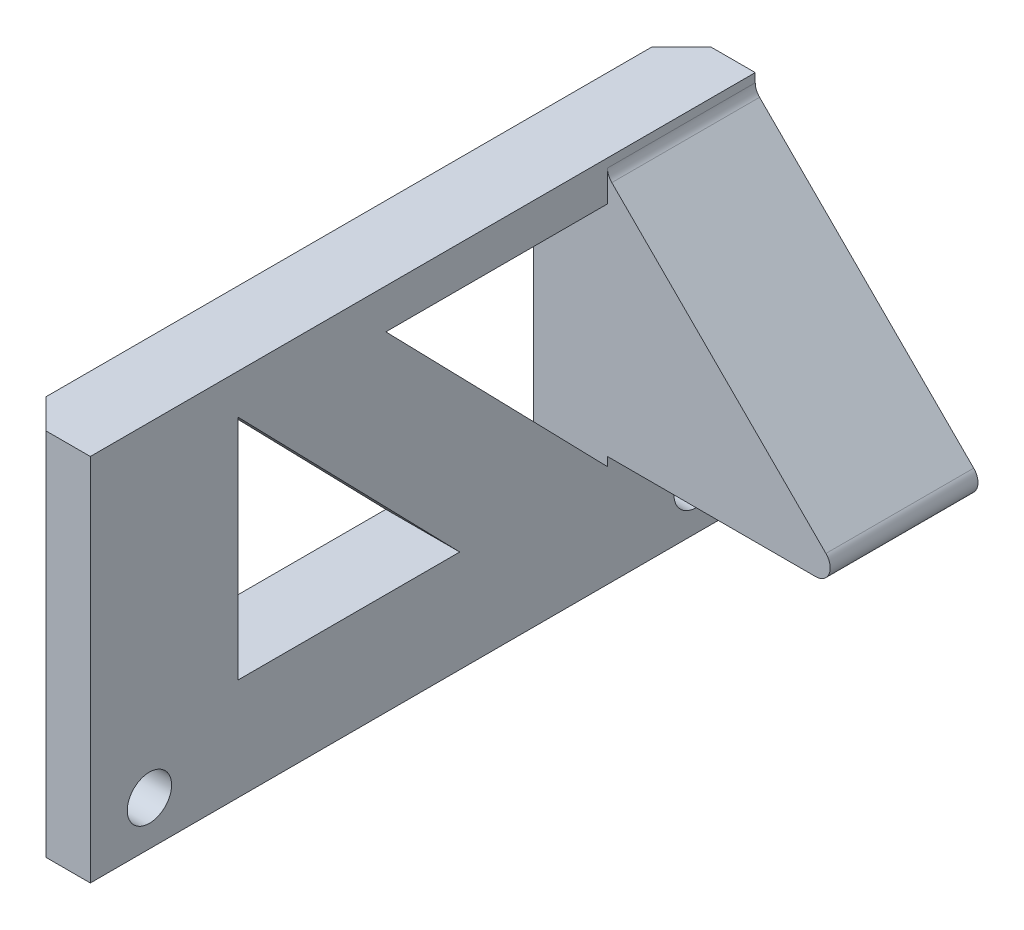
ISO-10303-21;
HEADER;
FILE_DESCRIPTION(('STEP AP214'),'2;1');
FILE_NAME('part.step','',(''),(''),'','','');
FILE_SCHEMA(('AUTOMOTIVE_DESIGN { 1 0 10303 214 1 1 1 1 }'));
ENDSEC;
DATA;
#1=APPLICATION_CONTEXT('core data for automotive mechanical design processes');
#2=APPLICATION_PROTOCOL_DEFINITION('international standard','automotive_design',2000,#1);
#3=PRODUCT_CONTEXT('',#1,'mechanical');
#4=PRODUCT('Part','Part','',(#3));
#5=PRODUCT_RELATED_PRODUCT_CATEGORY('part','',(#4));
#6=PRODUCT_DEFINITION_FORMATION('','',#4);
#7=PRODUCT_DEFINITION_CONTEXT('part definition',#1,'design');
#8=PRODUCT_DEFINITION('design','',#6,#7);
#9=PRODUCT_DEFINITION_SHAPE('','',#8);
#10=(LENGTH_UNIT() NAMED_UNIT(*) SI_UNIT(.MILLI.,.METRE.));
#11=(NAMED_UNIT(*) PLANE_ANGLE_UNIT() SI_UNIT($,.RADIAN.));
#12=(NAMED_UNIT(*) SI_UNIT($,.STERADIAN.) SOLID_ANGLE_UNIT());
#13=UNCERTAINTY_MEASURE_WITH_UNIT(LENGTH_MEASURE(1.E-05),#10,'distance_accuracy_value','');
#14=(GEOMETRIC_REPRESENTATION_CONTEXT(3) GLOBAL_UNCERTAINTY_ASSIGNED_CONTEXT((#13)) GLOBAL_UNIT_ASSIGNED_CONTEXT((#10,
#11,#12)) REPRESENTATION_CONTEXT('',''));
#15=CARTESIAN_POINT('',(0.,0.,0.));
#16=DIRECTION('',(0.,0.,1.));
#17=DIRECTION('',(1.,0.,0.));
#18=AXIS2_PLACEMENT_3D('',#15,#16,#17);
#19=CARTESIAN_POINT('',(5.,12.5,-22.5));
#20=DIRECTION('',(0.,0.,1.));
#21=DIRECTION('',(1.,0.,0.));
#22=AXIS2_PLACEMENT_3D('',#19,#20,#21);
#23=PLANE('',#22);
#24=DIRECTION('',(0.707106781186551,-0.707106781186544,0.));
#25=VECTOR('',#24,1.);
#26=CARTESIAN_POINT('',(21.4902925852937,-5.,-22.5));
#27=LINE('',#26,#25);
#28=CARTESIAN_POINT('',(5.29289321881346,11.1973993664801,-22.5));
#29=VERTEX_POINT('',#28);
#30=CARTESIAN_POINT('',(19.7831858041071,-3.29289321881345,-22.5));
#31=VERTEX_POINT('',#30);
#32=EDGE_CURVE('E295',#29,#31,#27,.T.);
#33=ORIENTED_EDGE('',*,*,#32,.T.);
#34=CARTESIAN_POINT('',(19.0760790229206,-4.,-22.5));
#35=DIRECTION('',(0.,0.,1.));
#36=DIRECTION('',(1.,0.,0.));
#37=AXIS2_PLACEMENT_3D('',#34,#35,#36);
#38=CIRCLE('',#37,1.);
#39=CARTESIAN_POINT('',(19.0760790229206,-5.,-22.5));
#40=VERTEX_POINT('',#39);
#41=EDGE_CURVE('E284',#31,#40,#38,.F.);
#42=ORIENTED_EDGE('',*,*,#41,.T.);
#43=DIRECTION('',(-1.,0.,0.));
#44=VECTOR('',#43,1.);
#45=CARTESIAN_POINT('',(5.,-5.,-22.5));
#46=LINE('',#45,#44);
#47=CARTESIAN_POINT('',(5.,-5.,-22.5));
#48=VERTEX_POINT('',#47);
#49=EDGE_CURVE('E302',#40,#48,#46,.T.);
#50=ORIENTED_EDGE('',*,*,#49,.T.);
#51=DIRECTION('',(0.,1.,0.));
#52=VECTOR('',#51,1.);
#53=CARTESIAN_POINT('',(5.,12.5,-22.5));
#54=LINE('',#53,#52);
#55=CARTESIAN_POINT('',(5.,-12.5,-22.5));
#56=VERTEX_POINT('',#55);
#57=EDGE_CURVE('E174',#56,#48,#54,.T.);
#58=ORIENTED_EDGE('',*,*,#57,.F.);
#59=DIRECTION('',(-1.,0.,0.));
#60=VECTOR('',#59,1.);
#61=CARTESIAN_POINT('',(5.,-12.5,-22.5));
#62=LINE('',#61,#60);
#63=CARTESIAN_POINT('',(2.,-12.5,-22.5));
#64=VERTEX_POINT('',#63);
#65=EDGE_CURVE('E242',#56,#64,#62,.T.);
#66=ORIENTED_EDGE('',*,*,#65,.T.);
#67=DIRECTION('',(0.,1.,0.));
#68=VECTOR('',#67,1.);
#69=CARTESIAN_POINT('',(2.,12.5,-22.5));
#70=LINE('',#69,#68);
#71=CARTESIAN_POINT('',(2.,12.5,-22.5));
#72=VERTEX_POINT('',#71);
#73=EDGE_CURVE('E277',#64,#72,#70,.T.);
#74=ORIENTED_EDGE('',*,*,#73,.T.);
#75=DIRECTION('',(-1.,0.,0.));
#76=VECTOR('',#75,1.);
#77=CARTESIAN_POINT('',(5.,12.5,-22.5));
#78=LINE('',#77,#76);
#79=CARTESIAN_POINT('',(5.,12.5,-22.5));
#80=VERTEX_POINT('',#79);
#81=EDGE_CURVE('E259',#80,#72,#78,.T.);
#82=ORIENTED_EDGE('',*,*,#81,.F.);
#83=CARTESIAN_POINT('',(5.,11.9045061476666,-22.5));
#84=VERTEX_POINT('',#83);
#85=EDGE_CURVE('E238',#84,#80,#54,.T.);
#86=ORIENTED_EDGE('',*,*,#85,.F.);
#87=CARTESIAN_POINT('',(6.,11.9045061476666,-22.5));
#88=DIRECTION('',(0.,0.,1.));
#89=DIRECTION('',(1.,0.,0.));
#90=AXIS2_PLACEMENT_3D('',#87,#88,#89);
#91=CIRCLE('',#90,1.);
#92=EDGE_CURVE('E47',#84,#29,#91,.T.);
#93=ORIENTED_EDGE('',*,*,#92,.T.);
#94=EDGE_LOOP('',(#33,#42,#50,#58,#66,#74,#82,#86,#93));
#95=FACE_BOUND('',#94,.T.);
#96=ADVANCED_FACE('F41',(#95),#23,.F.);
#97=CARTESIAN_POINT('',(5.,12.5,22.5));
#98=DIRECTION('',(0.,-1.,0.));
#99=DIRECTION('',(0.,0.,-1.));
#100=AXIS2_PLACEMENT_3D('',#97,#98,#99);
#101=PLANE('',#100);
#102=DIRECTION('',(0.,0.,1.));
#103=VECTOR('',#102,1.);
#104=CARTESIAN_POINT('',(0.,12.5,22.5));
#105=LINE('',#104,#103);
#106=CARTESIAN_POINT('',(0.,12.5,-20.5));
#107=VERTEX_POINT('',#106);
#108=CARTESIAN_POINT('',(0.,12.5,20.5));
#109=VERTEX_POINT('',#108);
#110=EDGE_CURVE('E227',#107,#109,#105,.T.);
#111=ORIENTED_EDGE('',*,*,#110,.T.);
#112=DIRECTION('',(-0.707106781186546,0.,-0.707106781186549));
#113=VECTOR('',#112,1.);
#114=CARTESIAN_POINT('',(2.,12.5,22.5));
#115=LINE('',#114,#113);
#116=CARTESIAN_POINT('',(2.,12.5,22.5));
#117=VERTEX_POINT('',#116);
#118=EDGE_CURVE('E274',#109,#117,#115,.F.);
#119=ORIENTED_EDGE('',*,*,#118,.T.);
#120=DIRECTION('',(-1.,0.,0.));
#121=VECTOR('',#120,1.);
#122=CARTESIAN_POINT('',(5.,12.5,22.5));
#123=LINE('',#122,#121);
#124=CARTESIAN_POINT('',(5.,12.5,22.5));
#125=VERTEX_POINT('',#124);
#126=EDGE_CURVE('E253',#125,#117,#123,.T.);
#127=ORIENTED_EDGE('',*,*,#126,.F.);
#128=DIRECTION('',(0.,0.,1.));
#129=VECTOR('',#128,1.);
#130=CARTESIAN_POINT('',(5.,12.5,22.5));
#131=LINE('',#130,#129);
#132=EDGE_CURVE('E240',#80,#125,#131,.T.);
#133=ORIENTED_EDGE('',*,*,#132,.F.);
#134=ORIENTED_EDGE('',*,*,#81,.T.);
#135=DIRECTION('',(0.707106781186546,0.,-0.707106781186549));
#136=VECTOR('',#135,1.);
#137=CARTESIAN_POINT('',(2.,12.5,-22.5));
#138=LINE('',#137,#136);
#139=EDGE_CURVE('E275',#72,#107,#138,.F.);
#140=ORIENTED_EDGE('',*,*,#139,.T.);
#141=EDGE_LOOP('',(#111,#119,#127,#133,#134,#140));
#142=FACE_BOUND('',#141,.T.);
#143=ADVANCED_FACE('F344',(#142),#101,.F.);
#144=CARTESIAN_POINT('',(5.,12.5,22.5));
#145=DIRECTION('',(0.,0.,-1.));
#146=DIRECTION('',(-1.,0.,0.));
#147=AXIS2_PLACEMENT_3D('',#144,#145,#146);
#148=PLANE('',#147);
#149=ORIENTED_EDGE('',*,*,#126,.T.);
#150=DIRECTION('',(0.,-1.,0.));
#151=VECTOR('',#150,1.);
#152=CARTESIAN_POINT('',(2.,12.5,22.5));
#153=LINE('',#152,#151);
#154=CARTESIAN_POINT('',(2.,-12.5,22.5));
#155=VERTEX_POINT('',#154);
#156=EDGE_CURVE('E263',#117,#155,#153,.T.);
#157=ORIENTED_EDGE('',*,*,#156,.T.);
#158=DIRECTION('',(-1.,0.,0.));
#159=VECTOR('',#158,1.);
#160=CARTESIAN_POINT('',(5.,-12.5,22.5));
#161=LINE('',#160,#159);
#162=CARTESIAN_POINT('',(5.,-12.5,22.5));
#163=VERTEX_POINT('',#162);
#164=EDGE_CURVE('E255',#163,#155,#161,.T.);
#165=ORIENTED_EDGE('',*,*,#164,.F.);
#166=DIRECTION('',(0.,-1.,0.));
#167=VECTOR('',#166,1.);
#168=CARTESIAN_POINT('',(5.,12.5,22.5));
#169=LINE('',#168,#167);
#170=EDGE_CURVE('E239',#125,#163,#169,.T.);
#171=ORIENTED_EDGE('',*,*,#170,.F.);
#172=EDGE_LOOP('',(#149,#157,#165,#171));
#173=FACE_BOUND('',#172,.T.);
#174=ADVANCED_FACE('F350',(#173),#148,.F.);
#175=CARTESIAN_POINT('',(5.,-12.5,22.5));
#176=DIRECTION('',(0.,1.,0.));
#177=DIRECTION('',(0.,0.,1.));
#178=AXIS2_PLACEMENT_3D('',#175,#176,#177);
#179=PLANE('',#178);
#180=ORIENTED_EDGE('',*,*,#164,.T.);
#181=DIRECTION('',(0.707106781186546,0.,0.707106781186549));
#182=VECTOR('',#181,1.);
#183=CARTESIAN_POINT('',(2.,-12.5,22.5));
#184=LINE('',#183,#182);
#185=CARTESIAN_POINT('',(0.,-12.5,20.5));
#186=VERTEX_POINT('',#185);
#187=EDGE_CURVE('E269',#155,#186,#184,.F.);
#188=ORIENTED_EDGE('',*,*,#187,.T.);
#189=DIRECTION('',(0.,0.,-1.));
#190=VECTOR('',#189,1.);
#191=CARTESIAN_POINT('',(0.,-12.5,22.5));
#192=LINE('',#191,#190);
#193=CARTESIAN_POINT('',(0.,-12.5,-20.5));
#194=VERTEX_POINT('',#193);
#195=EDGE_CURVE('E250',#186,#194,#192,.T.);
#196=ORIENTED_EDGE('',*,*,#195,.T.);
#197=DIRECTION('',(-0.707106781186546,0.,0.707106781186549));
#198=VECTOR('',#197,1.);
#199=CARTESIAN_POINT('',(2.,-12.5,-22.5));
#200=LINE('',#199,#198);
#201=EDGE_CURVE('E264',#194,#64,#200,.F.);
#202=ORIENTED_EDGE('',*,*,#201,.T.);
#203=ORIENTED_EDGE('',*,*,#65,.F.);
#204=DIRECTION('',(0.,0.,-1.));
#205=VECTOR('',#204,1.);
#206=CARTESIAN_POINT('',(5.,-12.5,22.5));
#207=LINE('',#206,#205);
#208=EDGE_CURVE('E245',#163,#56,#207,.T.);
#209=ORIENTED_EDGE('',*,*,#208,.F.);
#210=EDGE_LOOP('',(#180,#188,#196,#202,#203,#209));
#211=FACE_BOUND('',#210,.T.);
#212=ADVANCED_FACE('F353',(#211),#179,.F.);
#213=CARTESIAN_POINT('',(5.,0.,0.));
#214=DIRECTION('',(1.,0.,0.));
#215=DIRECTION('',(0.,0.,-1.));
#216=AXIS2_PLACEMENT_3D('',#213,#214,#215);
#217=PLANE('',#216);
#218=DIRECTION('',(0.,1.,0.));
#219=VECTOR('',#218,1.);
#220=CARTESIAN_POINT('',(5.,11.4902925852935,-12.5));
#221=LINE('',#220,#219);
#222=CARTESIAN_POINT('',(5.,9.80361420998697,-12.5));
#223=VERTEX_POINT('',#222);
#224=CARTESIAN_POINT('',(5.,11.9045061476666,-12.5));
#225=VERTEX_POINT('',#224);
#226=EDGE_CURVE('E57',#223,#225,#221,.T.);
#227=ORIENTED_EDGE('',*,*,#226,.T.);
#228=DIRECTION('',(0.,0.,-1.));
#229=VECTOR('',#228,1.);
#230=CARTESIAN_POINT('',(5.,11.9045061476666,-22.5));
#231=LINE('',#230,#229);
#232=EDGE_CURVE('E288',#225,#84,#231,.T.);
#233=ORIENTED_EDGE('',*,*,#232,.T.);
#234=ORIENTED_EDGE('',*,*,#85,.T.);
#235=ORIENTED_EDGE('',*,*,#132,.T.);
#236=ORIENTED_EDGE('',*,*,#170,.T.);
#237=ORIENTED_EDGE('',*,*,#208,.T.);
#238=ORIENTED_EDGE('',*,*,#57,.T.);
#239=DIRECTION('',(0.,0.,-1.));
#240=VECTOR('',#239,1.);
#241=CARTESIAN_POINT('',(5.,-5.,-12.5));
#242=LINE('',#241,#240);
#243=CARTESIAN_POINT('',(5.,-5.,-12.5));
#244=VERTEX_POINT('',#243);
#245=EDGE_CURVE('E162',#244,#48,#242,.T.);
#246=ORIENTED_EDGE('',*,*,#245,.F.);
#247=DIRECTION('',(0.,1.,0.));
#248=VECTOR('',#247,1.);
#249=CARTESIAN_POINT('',(5.,9.80361420998697,-12.5));
#250=LINE('',#249,#248);
#251=CARTESIAN_POINT('',(5.,-5.59947650810714,-12.5));
#252=VERTEX_POINT('',#251);
#253=EDGE_CURVE('E173',#252,#244,#250,.T.);
#254=ORIENTED_EDGE('',*,*,#253,.F.);
#255=DIRECTION('',(0.,-0.716418791651359,-0.697670491685585));
#256=VECTOR('',#255,1.);
#257=CARTESIAN_POINT('',(5.,-5.59947650810714,-12.5));
#258=LINE('',#257,#256);
#259=CARTESIAN_POINT('',(5.,9.80361420998697,2.5));
#260=VERTEX_POINT('',#259);
#261=EDGE_CURVE('E185',#260,#252,#258,.T.);
#262=ORIENTED_EDGE('',*,*,#261,.F.);
#263=DIRECTION('',(0.,0.,1.));
#264=VECTOR('',#263,1.);
#265=CARTESIAN_POINT('',(5.,9.80361420998697,2.5));
#266=LINE('',#265,#264);
#267=EDGE_CURVE('E182',#223,#260,#266,.T.);
#268=ORIENTED_EDGE('',*,*,#267,.F.);
#269=EDGE_LOOP('',(#227,#233,#234,#235,#236,#237,#238,#246,#254,#262,#268));
#270=FACE_BOUND('',#269,.T.);
#271=DIRECTION('',(0.,0.716418791651359,0.697670491685585));
#272=VECTOR('',#271,1.);
#273=CARTESIAN_POINT('',(5.,-5.59947650810714,-2.5));
#274=LINE('',#273,#272);
#275=CARTESIAN_POINT('',(5.,-5.59947650810714,-2.5));
#276=VERTEX_POINT('',#275);
#277=CARTESIAN_POINT('',(5.,9.80361420998697,12.5));
#278=VERTEX_POINT('',#277);
#279=EDGE_CURVE('E184',#276,#278,#274,.T.);
#280=ORIENTED_EDGE('',*,*,#279,.F.);
#281=DIRECTION('',(0.,0.,-1.));
#282=VECTOR('',#281,1.);
#283=CARTESIAN_POINT('',(5.,-5.59947650810714,12.5));
#284=LINE('',#283,#282);
#285=CARTESIAN_POINT('',(5.,-5.59947650810714,12.5));
#286=VERTEX_POINT('',#285);
#287=EDGE_CURVE('E203',#286,#276,#284,.T.);
#288=ORIENTED_EDGE('',*,*,#287,.F.);
#289=DIRECTION('',(0.,-1.,0.));
#290=VECTOR('',#289,1.);
#291=CARTESIAN_POINT('',(5.,9.80361420998697,12.5));
#292=LINE('',#291,#290);
#293=EDGE_CURVE('E215',#278,#286,#292,.T.);
#294=ORIENTED_EDGE('',*,*,#293,.F.);
#295=EDGE_LOOP('',(#280,#288,#294));
#296=FACE_BOUND('',#295,.T.);
#297=CARTESIAN_POINT('',(5.,-9.5,18.5));
#298=DIRECTION('',(1.,0.,0.));
#299=DIRECTION('',(0.,0.,-1.));
#300=AXIS2_PLACEMENT_3D('',#297,#298,#299);
#301=CIRCLE('',#300,1.5);
#302=CARTESIAN_POINT('',(5.,-9.5,17.));
#303=VERTEX_POINT('',#302);
#304=EDGE_CURVE('E226',#303,#303,#301,.T.);
#305=ORIENTED_EDGE('',*,*,#304,.F.);
#306=EDGE_LOOP('',(#305));
#307=FACE_BOUND('',#306,.T.);
#308=CARTESIAN_POINT('',(5.,-9.5,-18.5));
#309=DIRECTION('',(1.,0.,0.));
#310=DIRECTION('',(0.,0.,-1.));
#311=AXIS2_PLACEMENT_3D('',#308,#309,#310);
#312=CIRCLE('',#311,1.5);
#313=CARTESIAN_POINT('',(5.,-9.5,-20.));
#314=VERTEX_POINT('',#313);
#315=EDGE_CURVE('E233',#314,#314,#312,.T.);
#316=ORIENTED_EDGE('',*,*,#315,.F.);
#317=EDGE_LOOP('',(#316));
#318=FACE_BOUND('',#317,.T.);
#319=ADVANCED_FACE('F167',(#270,#296,#307,#318),#217,.T.);
#320=CARTESIAN_POINT('',(0.,0.,0.));
#321=DIRECTION('',(1.,0.,0.));
#322=DIRECTION('',(0.,0.,-1.));
#323=AXIS2_PLACEMENT_3D('',#320,#321,#322);
#324=PLANE('',#323);
#325=DIRECTION('',(0.,0.,1.));
#326=VECTOR('',#325,1.);
#327=CARTESIAN_POINT('',(0.,9.80361420998697,2.5));
#328=LINE('',#327,#326);
#329=CARTESIAN_POINT('',(0.,9.80361420998697,-12.5));
#330=VERTEX_POINT('',#329);
#331=CARTESIAN_POINT('',(0.,9.80361420998697,2.5));
#332=VERTEX_POINT('',#331);
#333=EDGE_CURVE('E195',#330,#332,#328,.T.);
#334=ORIENTED_EDGE('',*,*,#333,.T.);
#335=DIRECTION('',(0.,-0.716418791651359,-0.697670491685585));
#336=VECTOR('',#335,1.);
#337=CARTESIAN_POINT('',(0.,-5.59947650810714,-12.5));
#338=LINE('',#337,#336);
#339=CARTESIAN_POINT('',(0.,-5.59947650810714,-12.5));
#340=VERTEX_POINT('',#339);
#341=EDGE_CURVE('E189',#332,#340,#338,.T.);
#342=ORIENTED_EDGE('',*,*,#341,.T.);
#343=DIRECTION('',(0.,1.,0.));
#344=VECTOR('',#343,1.);
#345=CARTESIAN_POINT('',(0.,9.80361420998697,-12.5));
#346=LINE('',#345,#344);
#347=EDGE_CURVE('E193',#340,#330,#346,.T.);
#348=ORIENTED_EDGE('',*,*,#347,.T.);
#349=EDGE_LOOP('',(#334,#342,#348));
#350=FACE_BOUND('',#349,.T.);
#351=DIRECTION('',(0.,0.,-1.));
#352=VECTOR('',#351,1.);
#353=CARTESIAN_POINT('',(0.,-5.59947650810714,12.5));
#354=LINE('',#353,#352);
#355=CARTESIAN_POINT('',(0.,-5.59947650810714,12.5));
#356=VERTEX_POINT('',#355);
#357=CARTESIAN_POINT('',(0.,-5.59947650810714,-2.5));
#358=VERTEX_POINT('',#357);
#359=EDGE_CURVE('E210',#356,#358,#354,.T.);
#360=ORIENTED_EDGE('',*,*,#359,.T.);
#361=DIRECTION('',(0.,0.716418791651359,0.697670491685585));
#362=VECTOR('',#361,1.);
#363=CARTESIAN_POINT('',(0.,-5.59947650810714,-2.5));
#364=LINE('',#363,#362);
#365=CARTESIAN_POINT('',(0.,9.80361420998697,12.5));
#366=VERTEX_POINT('',#365);
#367=EDGE_CURVE('E197',#358,#366,#364,.T.);
#368=ORIENTED_EDGE('',*,*,#367,.T.);
#369=DIRECTION('',(0.,-1.,0.));
#370=VECTOR('',#369,1.);
#371=CARTESIAN_POINT('',(0.,9.80361420998697,12.5));
#372=LINE('',#371,#370);
#373=EDGE_CURVE('E205',#366,#356,#372,.T.);
#374=ORIENTED_EDGE('',*,*,#373,.T.);
#375=EDGE_LOOP('',(#360,#368,#374));
#376=FACE_BOUND('',#375,.T.);
#377=CARTESIAN_POINT('',(0.,-9.5,18.5));
#378=DIRECTION('',(1.,0.,0.));
#379=DIRECTION('',(0.,0.,-1.));
#380=AXIS2_PLACEMENT_3D('',#377,#378,#379);
#381=CIRCLE('',#380,1.5);
#382=CARTESIAN_POINT('',(0.,-9.5,17.));
#383=VERTEX_POINT('',#382);
#384=EDGE_CURVE('E223',#383,#383,#381,.T.);
#385=ORIENTED_EDGE('',*,*,#384,.T.);
#386=EDGE_LOOP('',(#385));
#387=FACE_BOUND('',#386,.T.);
#388=CARTESIAN_POINT('',(0.,-9.5,-18.5));
#389=DIRECTION('',(1.,0.,0.));
#390=DIRECTION('',(0.,0.,-1.));
#391=AXIS2_PLACEMENT_3D('',#388,#389,#390);
#392=CIRCLE('',#391,1.5);
#393=CARTESIAN_POINT('',(0.,-9.5,-20.));
#394=VERTEX_POINT('',#393);
#395=EDGE_CURVE('E219',#394,#394,#392,.T.);
#396=ORIENTED_EDGE('',*,*,#395,.T.);
#397=EDGE_LOOP('',(#396));
#398=FACE_BOUND('',#397,.T.);
#399=ORIENTED_EDGE('',*,*,#195,.F.);
#400=DIRECTION('',(0.,1.,0.));
#401=VECTOR('',#400,1.);
#402=CARTESIAN_POINT('',(0.,0.,20.5));
#403=LINE('',#402,#401);
#404=EDGE_CURVE('E267',#186,#109,#403,.T.);
#405=ORIENTED_EDGE('',*,*,#404,.T.);
#406=ORIENTED_EDGE('',*,*,#110,.F.);
#407=DIRECTION('',(0.,-1.,0.));
#408=VECTOR('',#407,1.);
#409=CARTESIAN_POINT('',(0.,0.,-20.5));
#410=LINE('',#409,#408);
#411=EDGE_CURVE('E270',#107,#194,#410,.T.);
#412=ORIENTED_EDGE('',*,*,#411,.T.);
#413=EDGE_LOOP('',(#399,#405,#406,#412));
#414=FACE_BOUND('',#413,.T.);
#415=ADVANCED_FACE('F322',(#350,#376,#387,#398,#414),#324,.F.);
#416=CARTESIAN_POINT('',(0.,-9.5,-18.5));
#417=DIRECTION('',(1.,0.,0.));
#418=DIRECTION('',(0.,0.,-1.));
#419=AXIS2_PLACEMENT_3D('',#416,#417,#418);
#420=CYLINDRICAL_SURFACE('',#419,1.5);
#421=ORIENTED_EDGE('',*,*,#395,.F.);
#422=EDGE_LOOP('',(#421));
#423=FACE_BOUND('',#422,.T.);
#424=ORIENTED_EDGE('',*,*,#315,.T.);
#425=EDGE_LOOP('',(#424));
#426=FACE_BOUND('',#425,.T.);
#427=ADVANCED_FACE('F321',(#423,#426),#420,.F.);
#428=CARTESIAN_POINT('',(0.,-9.5,18.5));
#429=DIRECTION('',(1.,0.,0.));
#430=DIRECTION('',(0.,0.,-1.));
#431=AXIS2_PLACEMENT_3D('',#428,#429,#430);
#432=CYLINDRICAL_SURFACE('',#431,1.5);
#433=ORIENTED_EDGE('',*,*,#384,.F.);
#434=EDGE_LOOP('',(#433));
#435=FACE_BOUND('',#434,.T.);
#436=ORIENTED_EDGE('',*,*,#304,.T.);
#437=EDGE_LOOP('',(#436));
#438=FACE_BOUND('',#437,.T.);
#439=ADVANCED_FACE('F403',(#435,#438),#432,.F.);
#440=CARTESIAN_POINT('',(0.,-5.59947650810714,-2.5));
#441=DIRECTION('',(0.,0.697670491685585,-0.716418791651359));
#442=DIRECTION('',(0.,0.716418791651359,0.697670491685585));
#443=AXIS2_PLACEMENT_3D('',#440,#441,#442);
#444=PLANE('',#443);
#445=ORIENTED_EDGE('',*,*,#279,.T.);
#446=DIRECTION('',(1.,0.,0.));
#447=VECTOR('',#446,1.);
#448=CARTESIAN_POINT('',(0.,9.80361420998697,12.5));
#449=LINE('',#448,#447);
#450=EDGE_CURVE('E208',#366,#278,#449,.T.);
#451=ORIENTED_EDGE('',*,*,#450,.F.);
#452=ORIENTED_EDGE('',*,*,#367,.F.);
#453=DIRECTION('',(1.,0.,0.));
#454=VECTOR('',#453,1.);
#455=CARTESIAN_POINT('',(0.,-5.59947650810714,-2.5));
#456=LINE('',#455,#454);
#457=EDGE_CURVE('E220',#358,#276,#456,.T.);
#458=ORIENTED_EDGE('',*,*,#457,.T.);
#459=EDGE_LOOP('',(#445,#451,#452,#458));
#460=FACE_BOUND('',#459,.T.);
#461=ADVANCED_FACE('F400',(#460),#444,.F.);
#462=CARTESIAN_POINT('',(0.,-5.59947650810714,12.5));
#463=DIRECTION('',(0.,-1.,0.));
#464=DIRECTION('',(0.,0.,-1.));
#465=AXIS2_PLACEMENT_3D('',#462,#463,#464);
#466=PLANE('',#465);
#467=ORIENTED_EDGE('',*,*,#287,.T.);
#468=ORIENTED_EDGE('',*,*,#457,.F.);
#469=ORIENTED_EDGE('',*,*,#359,.F.);
#470=DIRECTION('',(1.,0.,0.));
#471=VECTOR('',#470,1.);
#472=CARTESIAN_POINT('',(0.,-5.59947650810714,12.5));
#473=LINE('',#472,#471);
#474=EDGE_CURVE('E217',#356,#286,#473,.T.);
#475=ORIENTED_EDGE('',*,*,#474,.T.);
#476=EDGE_LOOP('',(#467,#468,#469,#475));
#477=FACE_BOUND('',#476,.T.);
#478=ADVANCED_FACE('F392',(#477),#466,.F.);
#479=CARTESIAN_POINT('',(0.,9.80361420998697,12.5));
#480=DIRECTION('',(0.,0.,1.));
#481=DIRECTION('',(1.,0.,0.));
#482=AXIS2_PLACEMENT_3D('',#479,#480,#481);
#483=PLANE('',#482);
#484=ORIENTED_EDGE('',*,*,#293,.T.);
#485=ORIENTED_EDGE('',*,*,#474,.F.);
#486=ORIENTED_EDGE('',*,*,#373,.F.);
#487=ORIENTED_EDGE('',*,*,#450,.T.);
#488=EDGE_LOOP('',(#484,#485,#486,#487));
#489=FACE_BOUND('',#488,.T.);
#490=ADVANCED_FACE('F395',(#489),#483,.F.);
#491=CARTESIAN_POINT('',(0.,-5.59947650810714,-12.5));
#492=DIRECTION('',(0.,-0.697670491685585,0.716418791651359));
#493=DIRECTION('',(0.,-0.716418791651359,-0.697670491685585));
#494=AXIS2_PLACEMENT_3D('',#491,#492,#493);
#495=PLANE('',#494);
#496=ORIENTED_EDGE('',*,*,#261,.T.);
#497=DIRECTION('',(1.,0.,0.));
#498=VECTOR('',#497,1.);
#499=CARTESIAN_POINT('',(0.,-5.59947650810714,-12.5));
#500=LINE('',#499,#498);
#501=EDGE_CURVE('E181',#340,#252,#500,.T.);
#502=ORIENTED_EDGE('',*,*,#501,.F.);
#503=ORIENTED_EDGE('',*,*,#341,.F.);
#504=DIRECTION('',(1.,0.,0.));
#505=VECTOR('',#504,1.);
#506=CARTESIAN_POINT('',(0.,9.80361420998697,2.5));
#507=LINE('',#506,#505);
#508=EDGE_CURVE('E176',#332,#260,#507,.T.);
#509=ORIENTED_EDGE('',*,*,#508,.T.);
#510=EDGE_LOOP('',(#496,#502,#503,#509));
#511=FACE_BOUND('',#510,.T.);
#512=ADVANCED_FACE('F320',(#511),#495,.F.);
#513=CARTESIAN_POINT('',(0.,9.80361420998697,2.5));
#514=DIRECTION('',(0.,1.,0.));
#515=DIRECTION('',(0.,0.,1.));
#516=AXIS2_PLACEMENT_3D('',#513,#514,#515);
#517=PLANE('',#516);
#518=ORIENTED_EDGE('',*,*,#267,.T.);
#519=ORIENTED_EDGE('',*,*,#508,.F.);
#520=ORIENTED_EDGE('',*,*,#333,.F.);
#521=DIRECTION('',(1.,0.,0.));
#522=VECTOR('',#521,1.);
#523=CARTESIAN_POINT('',(0.,9.80361420998697,-12.5));
#524=LINE('',#523,#522);
#525=EDGE_CURVE('E313',#330,#223,#524,.T.);
#526=ORIENTED_EDGE('',*,*,#525,.T.);
#527=EDGE_LOOP('',(#518,#519,#520,#526));
#528=FACE_BOUND('',#527,.T.);
#529=ADVANCED_FACE('F316',(#528),#517,.F.);
#530=CARTESIAN_POINT('',(0.,9.80361420998697,-12.5));
#531=DIRECTION('',(0.,0.,-1.));
#532=DIRECTION('',(0.,1.,0.));
#533=AXIS2_PLACEMENT_3D('',#530,#531,#532);
#534=PLANE('',#533);
#535=DIRECTION('',(-1.,0.,0.));
#536=VECTOR('',#535,1.);
#537=CARTESIAN_POINT('',(5.,-5.,-12.5));
#538=LINE('',#537,#536);
#539=CARTESIAN_POINT('',(19.0760790229206,-5.,-12.5));
#540=VERTEX_POINT('',#539);
#541=EDGE_CURVE('E158',#540,#244,#538,.T.);
#542=ORIENTED_EDGE('',*,*,#541,.F.);
#543=CARTESIAN_POINT('',(19.0760790229206,-4.,-12.5));
#544=DIRECTION('',(0.,0.,-1.));
#545=DIRECTION('',(0.,1.,0.));
#546=AXIS2_PLACEMENT_3D('',#543,#544,#545);
#547=CIRCLE('',#546,1.);
#548=CARTESIAN_POINT('',(19.7831858041071,-3.29289321881345,-12.5));
#549=VERTEX_POINT('',#548);
#550=EDGE_CURVE('E286',#540,#549,#547,.F.);
#551=ORIENTED_EDGE('',*,*,#550,.T.);
#552=DIRECTION('',(0.707106781186551,-0.707106781186544,0.));
#553=VECTOR('',#552,1.);
#554=CARTESIAN_POINT('',(21.4902925852937,-5.,-12.5));
#555=LINE('',#554,#553);
#556=CARTESIAN_POINT('',(5.29289321881346,11.1973993664801,-12.5));
#557=VERTEX_POINT('',#556);
#558=EDGE_CURVE('E170',#557,#549,#555,.T.);
#559=ORIENTED_EDGE('',*,*,#558,.F.);
#560=CARTESIAN_POINT('',(6.,11.9045061476666,-12.5));
#561=DIRECTION('',(0.,0.,-1.));
#562=DIRECTION('',(0.,1.,0.));
#563=AXIS2_PLACEMENT_3D('',#560,#561,#562);
#564=CIRCLE('',#563,1.);
#565=EDGE_CURVE('E11',#557,#225,#564,.T.);
#566=ORIENTED_EDGE('',*,*,#565,.T.);
#567=ORIENTED_EDGE('',*,*,#226,.F.);
#568=ORIENTED_EDGE('',*,*,#525,.F.);
#569=ORIENTED_EDGE('',*,*,#347,.F.);
#570=ORIENTED_EDGE('',*,*,#501,.T.);
#571=ORIENTED_EDGE('',*,*,#253,.T.);
#572=EDGE_LOOP('',(#542,#551,#559,#566,#567,#568,#569,#570,#571));
#573=FACE_BOUND('',#572,.T.);
#574=ADVANCED_FACE('F177',(#573),#534,.F.);
#575=CARTESIAN_POINT('',(2.,12.5,22.5));
#576=DIRECTION('',(0.707106781186549,0.,-0.707106781186546));
#577=DIRECTION('',(0.,-1.,0.));
#578=AXIS2_PLACEMENT_3D('',#575,#576,#577);
#579=PLANE('',#578);
#580=ORIENTED_EDGE('',*,*,#118,.F.);
#581=ORIENTED_EDGE('',*,*,#404,.F.);
#582=ORIENTED_EDGE('',*,*,#187,.F.);
#583=ORIENTED_EDGE('',*,*,#156,.F.);
#584=EDGE_LOOP('',(#580,#581,#582,#583));
#585=FACE_BOUND('',#584,.T.);
#586=ADVANCED_FACE('F339',(#585),#579,.F.);
#587=CARTESIAN_POINT('',(2.,12.5,-22.5));
#588=DIRECTION('',(0.707106781186549,0.,0.707106781186546));
#589=DIRECTION('',(0.,1.,0.));
#590=AXIS2_PLACEMENT_3D('',#587,#588,#589);
#591=PLANE('',#590);
#592=ORIENTED_EDGE('',*,*,#201,.F.);
#593=ORIENTED_EDGE('',*,*,#411,.F.);
#594=ORIENTED_EDGE('',*,*,#139,.F.);
#595=ORIENTED_EDGE('',*,*,#73,.F.);
#596=EDGE_LOOP('',(#592,#593,#594,#595));
#597=FACE_BOUND('',#596,.T.);
#598=ADVANCED_FACE('F355',(#597),#591,.F.);
#599=CARTESIAN_POINT('',(5.,-5.,-12.5));
#600=DIRECTION('',(0.,-1.,0.));
#601=DIRECTION('',(1.,0.,0.));
#602=AXIS2_PLACEMENT_3D('',#599,#600,#601);
#603=PLANE('',#602);
#604=ORIENTED_EDGE('',*,*,#49,.F.);
#605=DIRECTION('',(0.,0.,-1.));
#606=VECTOR('',#605,1.);
#607=CARTESIAN_POINT('',(19.0760790229206,-5.,-12.5));
#608=LINE('',#607,#606);
#609=EDGE_CURVE('E64',#40,#540,#608,.F.);
#610=ORIENTED_EDGE('',*,*,#609,.T.);
#611=ORIENTED_EDGE('',*,*,#541,.T.);
#612=ORIENTED_EDGE('',*,*,#245,.T.);
#613=EDGE_LOOP('',(#604,#610,#611,#612));
#614=FACE_BOUND('',#613,.T.);
#615=ADVANCED_FACE('F163',(#614),#603,.T.);
#616=CARTESIAN_POINT('',(21.4902925852937,-5.,-12.5));
#617=DIRECTION('',(0.707106781186544,0.707106781186551,0.));
#618=DIRECTION('',(-0.707106781186551,0.707106781186544,0.));
#619=AXIS2_PLACEMENT_3D('',#616,#617,#618);
#620=PLANE('',#619);
#621=ORIENTED_EDGE('',*,*,#558,.T.);
#622=DIRECTION('',(0.,0.,-1.));
#623=VECTOR('',#622,1.);
#624=CARTESIAN_POINT('',(19.7831858041071,-3.29289321881345,-12.5));
#625=LINE('',#624,#623);
#626=EDGE_CURVE('E283',#549,#31,#625,.T.);
#627=ORIENTED_EDGE('',*,*,#626,.T.);
#628=ORIENTED_EDGE('',*,*,#32,.F.);
#629=DIRECTION('',(0.,0.,-1.));
#630=VECTOR('',#629,1.);
#631=CARTESIAN_POINT('',(5.29289321881345,11.1973993664801,-12.5));
#632=LINE('',#631,#630);
#633=EDGE_CURVE('E276',#29,#557,#632,.F.);
#634=ORIENTED_EDGE('',*,*,#633,.T.);
#635=EDGE_LOOP('',(#621,#627,#628,#634));
#636=FACE_BOUND('',#635,.T.);
#637=ADVANCED_FACE('F301',(#636),#620,.T.);
#638=CARTESIAN_POINT('',(19.0760790229206,-4.,-12.5));
#639=DIRECTION('',(0.,0.,-1.));
#640=DIRECTION('',(-1.,0.,0.));
#641=AXIS2_PLACEMENT_3D('',#638,#639,#640);
#642=CYLINDRICAL_SURFACE('',#641,1.);
#643=ORIENTED_EDGE('',*,*,#550,.F.);
#644=ORIENTED_EDGE('',*,*,#609,.F.);
#645=ORIENTED_EDGE('',*,*,#41,.F.);
#646=ORIENTED_EDGE('',*,*,#626,.F.);
#647=EDGE_LOOP('',(#643,#644,#645,#646));
#648=FACE_BOUND('',#647,.T.);
#649=ADVANCED_FACE('F358',(#648),#642,.T.);
#650=CARTESIAN_POINT('',(6.,11.9045061476666,0.));
#651=DIRECTION('',(0.,0.,1.));
#652=DIRECTION('',(1.,0.,0.));
#653=AXIS2_PLACEMENT_3D('',#650,#651,#652);
#654=CYLINDRICAL_SURFACE('',#653,1.);
#655=ORIENTED_EDGE('',*,*,#565,.F.);
#656=ORIENTED_EDGE('',*,*,#633,.F.);
#657=ORIENTED_EDGE('',*,*,#92,.F.);
#658=ORIENTED_EDGE('',*,*,#232,.F.);
#659=EDGE_LOOP('',(#655,#656,#657,#658));
#660=FACE_BOUND('',#659,.T.);
#661=ADVANCED_FACE('F43',(#660),#654,.F.);
#662=CLOSED_SHELL('',(#96,#143,#174,#212,#319,#415,#427,#439,#461,#478,#490,#512,#529,#574,#586,
#598,#615,#637,#649,#661));
#663=MANIFOLD_SOLID_BREP('B2',#662);
#664=ADVANCED_BREP_SHAPE_REPRESENTATION('',(#18,#663),#14);
#665=SHAPE_DEFINITION_REPRESENTATION(#9,#664);
ENDSEC;
END-ISO-10303-21;
